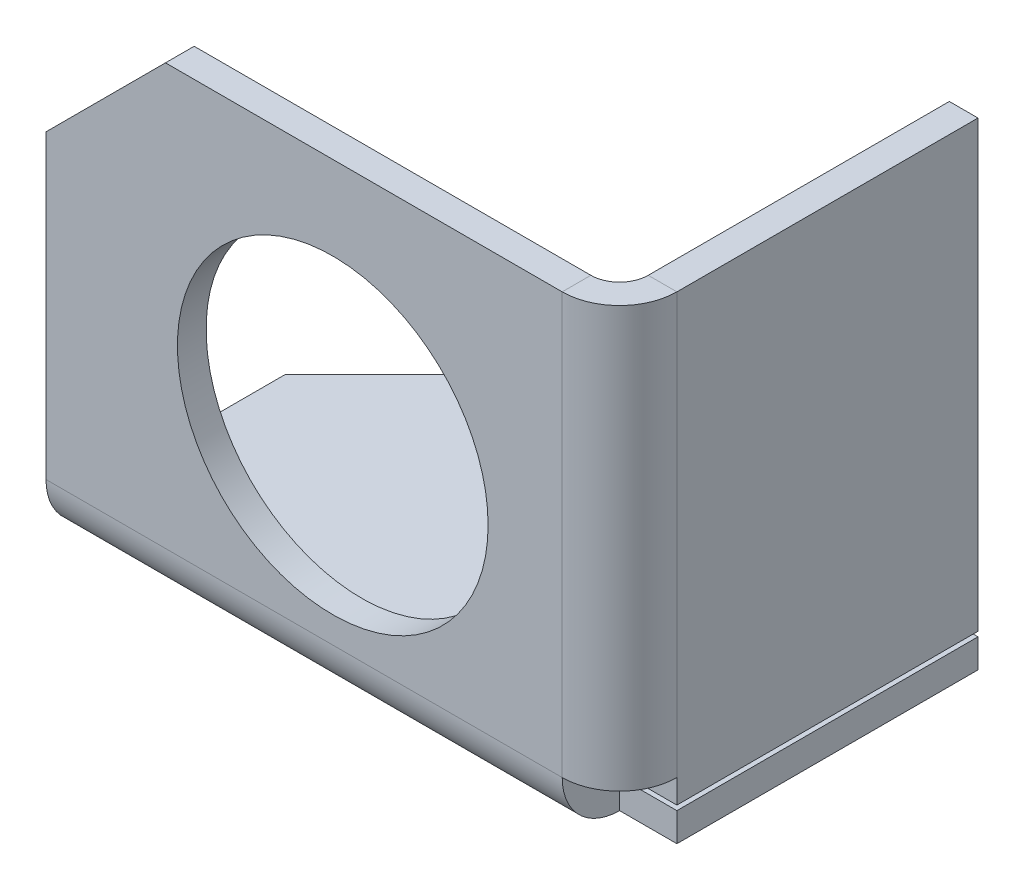
ISO-10303-21;
HEADER;
FILE_DESCRIPTION(('STEP AP214'),'2;1');
FILE_NAME('part.step','',(''),(''),'','','');
FILE_SCHEMA(('AUTOMOTIVE_DESIGN { 1 0 10303 214 1 1 1 1 }'));
ENDSEC;
DATA;
#1=APPLICATION_CONTEXT('core data for automotive mechanical design processes');
#2=APPLICATION_PROTOCOL_DEFINITION('international standard','automotive_design',2000,#1);
#3=PRODUCT_CONTEXT('',#1,'mechanical');
#4=PRODUCT('Part','Part','',(#3));
#5=PRODUCT_RELATED_PRODUCT_CATEGORY('part','',(#4));
#6=PRODUCT_DEFINITION_FORMATION('','',#4);
#7=PRODUCT_DEFINITION_CONTEXT('part definition',#1,'design');
#8=PRODUCT_DEFINITION('design','',#6,#7);
#9=PRODUCT_DEFINITION_SHAPE('','',#8);
#10=(LENGTH_UNIT() NAMED_UNIT(*) SI_UNIT(.MILLI.,.METRE.));
#11=(NAMED_UNIT(*) PLANE_ANGLE_UNIT() SI_UNIT($,.RADIAN.));
#12=(NAMED_UNIT(*) SI_UNIT($,.STERADIAN.) SOLID_ANGLE_UNIT());
#13=UNCERTAINTY_MEASURE_WITH_UNIT(LENGTH_MEASURE(1.E-05),#10,'distance_accuracy_value','');
#14=(GEOMETRIC_REPRESENTATION_CONTEXT(3) GLOBAL_UNCERTAINTY_ASSIGNED_CONTEXT((#13)) GLOBAL_UNIT_ASSIGNED_CONTEXT((#10,
#11,#12)) REPRESENTATION_CONTEXT('',''));
#15=CARTESIAN_POINT('',(0.,0.,0.));
#16=DIRECTION('',(0.,0.,1.));
#17=DIRECTION('',(1.,0.,0.));
#18=AXIS2_PLACEMENT_3D('',#15,#16,#17);
#19=CARTESIAN_POINT('',(0.,88.,6.));
#20=DIRECTION('',(0.,1.,0.));
#21=DIRECTION('',(0.,0.,-1.));
#22=AXIS2_PLACEMENT_3D('',#19,#20,#21);
#23=PLANE('',#22);
#24=DIRECTION('',(-1.,0.,0.));
#25=VECTOR('',#24,1.);
#26=CARTESIAN_POINT('',(0.,88.,6.));
#27=LINE('',#26,#25);
#28=CARTESIAN_POINT('',(108.,88.,6.00000000000001));
#29=VERTEX_POINT('',#28);
#30=CARTESIAN_POINT('',(25.,88.,6.));
#31=VERTEX_POINT('',#30);
#32=EDGE_CURVE('E334',#29,#31,#27,.T.);
#33=ORIENTED_EDGE('',*,*,#32,.F.);
#34=DIRECTION('',(0.,0.,1.));
#35=VECTOR('',#34,1.);
#36=CARTESIAN_POINT('',(108.,88.,0.));
#37=LINE('',#36,#35);
#38=CARTESIAN_POINT('',(108.,88.,0.));
#39=VERTEX_POINT('',#38);
#40=EDGE_CURVE('E348',#39,#29,#37,.T.);
#41=ORIENTED_EDGE('',*,*,#40,.F.);
#42=DIRECTION('',(-1.,0.,0.));
#43=VECTOR('',#42,1.);
#44=CARTESIAN_POINT('',(0.,88.,0.));
#45=LINE('',#44,#43);
#46=CARTESIAN_POINT('',(25.,88.,0.));
#47=VERTEX_POINT('',#46);
#48=EDGE_CURVE('E335',#39,#47,#45,.T.);
#49=ORIENTED_EDGE('',*,*,#48,.T.);
#50=DIRECTION('',(0.,0.,-1.));
#51=VECTOR('',#50,1.);
#52=CARTESIAN_POINT('',(25.,88.,6.));
#53=LINE('',#52,#51);
#54=EDGE_CURVE('E384',#31,#47,#53,.T.);
#55=ORIENTED_EDGE('',*,*,#54,.F.);
#56=EDGE_LOOP('',(#33,#41,#49,#55));
#57=FACE_BOUND('',#56,.T.);
#58=ADVANCED_FACE('F82',(#57),#23,.T.);
#59=CARTESIAN_POINT('',(0.,0.,6.));
#60=DIRECTION('',(0.,0.,1.));
#61=DIRECTION('',(-1.,0.,0.));
#62=AXIS2_PLACEMENT_3D('',#59,#60,#61);
#63=PLANE('',#62);
#64=CARTESIAN_POINT('',(60.,38.,6.));
#65=DIRECTION('',(0.,0.,1.));
#66=DIRECTION('',(1.,0.,0.));
#67=AXIS2_PLACEMENT_3D('',#64,#65,#66);
#68=CIRCLE('',#67,32.5);
#69=CARTESIAN_POINT('',(92.5,38.,6.));
#70=VERTEX_POINT('',#69);
#71=EDGE_CURVE('E322',#70,#70,#68,.T.);
#72=ORIENTED_EDGE('',*,*,#71,.F.);
#73=EDGE_LOOP('',(#72));
#74=FACE_BOUND('',#73,.T.);
#75=DIRECTION('',(0.,-1.,0.));
#76=VECTOR('',#75,1.);
#77=CARTESIAN_POINT('',(0.,0.,6.));
#78=LINE('',#77,#76);
#79=CARTESIAN_POINT('',(0.,62.9999999999999,6.));
#80=VERTEX_POINT('',#79);
#81=CARTESIAN_POINT('',(0.,0.,6.));
#82=VERTEX_POINT('',#81);
#83=EDGE_CURVE('E330',#80,#82,#78,.T.);
#84=ORIENTED_EDGE('',*,*,#83,.T.);
#85=DIRECTION('',(1.,0.,0.));
#86=VECTOR('',#85,1.);
#87=CARTESIAN_POINT('',(0.,0.,6.));
#88=LINE('',#87,#86);
#89=CARTESIAN_POINT('',(108.,0.,6.));
#90=VERTEX_POINT('',#89);
#91=EDGE_CURVE('E356',#82,#90,#88,.T.);
#92=ORIENTED_EDGE('',*,*,#91,.T.);
#93=DIRECTION('',(0.,-1.,0.));
#94=VECTOR('',#93,1.);
#95=CARTESIAN_POINT('',(108.,88.,6.00000000000001));
#96=LINE('',#95,#94);
#97=EDGE_CURVE('E339',#29,#90,#96,.T.);
#98=ORIENTED_EDGE('',*,*,#97,.F.);
#99=ORIENTED_EDGE('',*,*,#32,.T.);
#100=DIRECTION('',(-0.707106781186546,-0.707106781186549,0.));
#101=VECTOR('',#100,1.);
#102=CARTESIAN_POINT('',(-31.5,31.4999999999999,6.));
#103=LINE('',#102,#101);
#104=EDGE_CURVE('E13',#80,#31,#103,.F.);
#105=ORIENTED_EDGE('',*,*,#104,.F.);
#106=EDGE_LOOP('',(#84,#92,#98,#99,#105));
#107=FACE_BOUND('',#106,.T.);
#108=ADVANCED_FACE('F496',(#74,#107),#63,.T.);
#109=CARTESIAN_POINT('',(0.,0.,0.));
#110=DIRECTION('',(0.,0.,1.));
#111=DIRECTION('',(-1.,0.,0.));
#112=AXIS2_PLACEMENT_3D('',#109,#110,#111);
#113=PLANE('',#112);
#114=CARTESIAN_POINT('',(60.,38.,0.));
#115=DIRECTION('',(0.,0.,1.));
#116=DIRECTION('',(1.,0.,0.));
#117=AXIS2_PLACEMENT_3D('',#114,#115,#116);
#118=CIRCLE('',#117,32.5);
#119=CARTESIAN_POINT('',(92.5,38.,0.));
#120=VERTEX_POINT('',#119);
#121=EDGE_CURVE('E315',#120,#120,#118,.T.);
#122=ORIENTED_EDGE('',*,*,#121,.T.);
#123=EDGE_LOOP('',(#122));
#124=FACE_BOUND('',#123,.T.);
#125=ORIENTED_EDGE('',*,*,#48,.F.);
#126=DIRECTION('',(0.,-1.,0.));
#127=VECTOR('',#126,1.);
#128=CARTESIAN_POINT('',(108.,88.,0.));
#129=LINE('',#128,#127);
#130=CARTESIAN_POINT('',(108.,0.,0.));
#131=VERTEX_POINT('',#130);
#132=EDGE_CURVE('E352',#39,#131,#129,.T.);
#133=ORIENTED_EDGE('',*,*,#132,.T.);
#134=DIRECTION('',(1.,0.,0.));
#135=VECTOR('',#134,1.);
#136=CARTESIAN_POINT('',(0.,0.,0.));
#137=LINE('',#136,#135);
#138=CARTESIAN_POINT('',(0.,0.,0.));
#139=VERTEX_POINT('',#138);
#140=EDGE_CURVE('E364',#139,#131,#137,.T.);
#141=ORIENTED_EDGE('',*,*,#140,.F.);
#142=DIRECTION('',(0.,-1.,0.));
#143=VECTOR('',#142,1.);
#144=CARTESIAN_POINT('',(0.,0.,0.));
#145=LINE('',#144,#143);
#146=CARTESIAN_POINT('',(0.,62.9999999999999,0.));
#147=VERTEX_POINT('',#146);
#148=EDGE_CURVE('E326',#147,#139,#145,.T.);
#149=ORIENTED_EDGE('',*,*,#148,.F.);
#150=DIRECTION('',(0.707106781186546,0.707106781186549,0.));
#151=VECTOR('',#150,1.);
#152=CARTESIAN_POINT('',(25.,88.,0.));
#153=LINE('',#152,#151);
#154=EDGE_CURVE('E388',#47,#147,#153,.F.);
#155=ORIENTED_EDGE('',*,*,#154,.F.);
#156=EDGE_LOOP('',(#125,#133,#141,#149,#155));
#157=FACE_BOUND('',#156,.T.);
#158=ADVANCED_FACE('F501',(#124,#157),#113,.F.);
#159=CARTESIAN_POINT('',(0.,0.,6.));
#160=DIRECTION('',(-1.,0.,0.));
#161=DIRECTION('',(0.,0.,-1.));
#162=AXIS2_PLACEMENT_3D('',#159,#160,#161);
#163=PLANE('',#162);
#164=ORIENTED_EDGE('',*,*,#148,.T.);
#165=DIRECTION('',(0.,0.,-1.));
#166=VECTOR('',#165,1.);
#167=CARTESIAN_POINT('',(0.,0.,6.));
#168=LINE('',#167,#166);
#169=EDGE_CURVE('E368',#82,#139,#168,.T.);
#170=ORIENTED_EDGE('',*,*,#169,.F.);
#171=ORIENTED_EDGE('',*,*,#83,.F.);
#172=DIRECTION('',(0.,0.,1.));
#173=VECTOR('',#172,1.);
#174=CARTESIAN_POINT('',(0.,62.9999999999999,6.));
#175=LINE('',#174,#173);
#176=EDGE_CURVE('E91',#147,#80,#175,.T.);
#177=ORIENTED_EDGE('',*,*,#176,.F.);
#178=EDGE_LOOP('',(#164,#170,#171,#177));
#179=FACE_BOUND('',#178,.T.);
#180=ADVANCED_FACE('F497',(#179),#163,.T.);
#181=CARTESIAN_POINT('',(60.,38.,6.));
#182=DIRECTION('',(0.,0.,-1.));
#183=DIRECTION('',(1.,0.,0.));
#184=AXIS2_PLACEMENT_3D('',#181,#182,#183);
#185=CYLINDRICAL_SURFACE('',#184,32.5);
#186=ORIENTED_EDGE('',*,*,#71,.T.);
#187=EDGE_LOOP('',(#186));
#188=FACE_BOUND('',#187,.T.);
#189=ORIENTED_EDGE('',*,*,#121,.F.);
#190=EDGE_LOOP('',(#189));
#191=FACE_BOUND('',#190,.T.);
#192=ADVANCED_FACE('F535',(#188,#191),#185,.F.);
#193=CARTESIAN_POINT('',(108.,0.,-5.99999999999999));
#194=DIRECTION('',(0.,-1.,0.));
#195=DIRECTION('',(0.,0.,1.));
#196=AXIS2_PLACEMENT_3D('',#193,#194,#195);
#197=PLANE('',#196);
#198=DIRECTION('',(1.,0.,0.));
#199=VECTOR('',#198,1.);
#200=CARTESIAN_POINT('',(120.,0.,-6.0000000000001));
#201=LINE('',#200,#199);
#202=CARTESIAN_POINT('',(114.,0.,-6.00000000000005));
#203=VERTEX_POINT('',#202);
#204=CARTESIAN_POINT('',(120.,0.,-5.99999999999995));
#205=VERTEX_POINT('',#204);
#206=EDGE_CURVE('E252',#203,#205,#201,.T.);
#207=ORIENTED_EDGE('',*,*,#206,.T.);
#208=CARTESIAN_POINT('',(108.,0.,-5.99999999999999));
#209=DIRECTION('',(0.,-1.,0.));
#210=DIRECTION('',(0.,0.,-1.));
#211=AXIS2_PLACEMENT_3D('',#208,#209,#210);
#212=CIRCLE('',#211,12.);
#213=EDGE_CURVE('E306',#205,#90,#212,.T.);
#214=ORIENTED_EDGE('',*,*,#213,.T.);
#215=DIRECTION('',(0.,0.,1.));
#216=VECTOR('',#215,1.);
#217=CARTESIAN_POINT('',(108.,0.,0.));
#218=LINE('',#217,#216);
#219=EDGE_CURVE('E360',#131,#90,#218,.T.);
#220=ORIENTED_EDGE('',*,*,#219,.F.);
#221=CARTESIAN_POINT('',(108.,0.,-5.99999999999999));
#222=DIRECTION('',(0.,1.,0.));
#223=DIRECTION('',(0.,0.,1.));
#224=AXIS2_PLACEMENT_3D('',#221,#222,#223);
#225=CIRCLE('',#224,6.);
#226=EDGE_CURVE('E256',#203,#131,#225,.F.);
#227=ORIENTED_EDGE('',*,*,#226,.F.);
#228=EDGE_LOOP('',(#207,#214,#220,#227));
#229=FACE_BOUND('',#228,.T.);
#230=ADVANCED_FACE('F510',(#229),#197,.T.);
#231=CARTESIAN_POINT('',(108.,88.,-5.99999999999999));
#232=DIRECTION('',(0.,1.,0.));
#233=DIRECTION('',(0.,0.,-1.));
#234=AXIS2_PLACEMENT_3D('',#231,#232,#233);
#235=PLANE('',#234);
#236=CARTESIAN_POINT('',(108.,88.,-5.99999999999999));
#237=DIRECTION('',(0.,1.,0.));
#238=DIRECTION('',(0.,0.,1.));
#239=AXIS2_PLACEMENT_3D('',#236,#237,#238);
#240=CIRCLE('',#239,6.);
#241=CARTESIAN_POINT('',(114.,88.,-6.00000000000012));
#242=VERTEX_POINT('',#241);
#243=EDGE_CURVE('E311',#39,#242,#240,.T.);
#244=ORIENTED_EDGE('',*,*,#243,.F.);
#245=ORIENTED_EDGE('',*,*,#40,.T.);
#246=CARTESIAN_POINT('',(108.,88.,-5.99999999999999));
#247=DIRECTION('',(0.,1.,0.));
#248=DIRECTION('',(0.,0.,1.));
#249=AXIS2_PLACEMENT_3D('',#246,#247,#248);
#250=CIRCLE('',#249,12.);
#251=CARTESIAN_POINT('',(120.,88.,-6.0000000000001));
#252=VERTEX_POINT('',#251);
#253=EDGE_CURVE('E310',#29,#252,#250,.T.);
#254=ORIENTED_EDGE('',*,*,#253,.T.);
#255=DIRECTION('',(1.,0.,0.));
#256=VECTOR('',#255,1.);
#257=CARTESIAN_POINT('',(114.,88.,-6.00000000000012));
#258=LINE('',#257,#256);
#259=EDGE_CURVE('E295',#242,#252,#258,.T.);
#260=ORIENTED_EDGE('',*,*,#259,.F.);
#261=EDGE_LOOP('',(#244,#245,#254,#260));
#262=FACE_BOUND('',#261,.T.);
#263=ADVANCED_FACE('F517',(#262),#235,.T.);
#264=CARTESIAN_POINT('',(108.,133.330059269666,-5.99999999999999));
#265=DIRECTION('',(0.,-1.,0.));
#266=DIRECTION('',(0.,0.,1.));
#267=AXIS2_PLACEMENT_3D('',#264,#265,#266);
#268=CYLINDRICAL_SURFACE('',#267,12.);
#269=ORIENTED_EDGE('',*,*,#97,.T.);
#270=ORIENTED_EDGE('',*,*,#213,.F.);
#271=DIRECTION('',(0.,-1.,0.));
#272=VECTOR('',#271,1.);
#273=CARTESIAN_POINT('',(120.,0.,-6.0000000000001));
#274=LINE('',#273,#272);
#275=EDGE_CURVE('E244',#252,#205,#274,.T.);
#276=ORIENTED_EDGE('',*,*,#275,.F.);
#277=ORIENTED_EDGE('',*,*,#253,.F.);
#278=EDGE_LOOP('',(#269,#270,#276,#277));
#279=FACE_BOUND('',#278,.T.);
#280=ADVANCED_FACE('F514',(#279),#268,.T.);
#281=CARTESIAN_POINT('',(108.,133.330059269666,-5.99999999999999));
#282=DIRECTION('',(0.,-1.,0.));
#283=DIRECTION('',(0.,0.,1.));
#284=AXIS2_PLACEMENT_3D('',#281,#282,#283);
#285=CYLINDRICAL_SURFACE('',#284,6.);
#286=ORIENTED_EDGE('',*,*,#132,.F.);
#287=ORIENTED_EDGE('',*,*,#243,.T.);
#288=DIRECTION('',(0.,1.,0.));
#289=VECTOR('',#288,1.);
#290=CARTESIAN_POINT('',(114.,0.,-6.00000000000012));
#291=LINE('',#290,#289);
#292=EDGE_CURVE('E299',#203,#242,#291,.T.);
#293=ORIENTED_EDGE('',*,*,#292,.F.);
#294=ORIENTED_EDGE('',*,*,#226,.T.);
#295=EDGE_LOOP('',(#286,#287,#293,#294));
#296=FACE_BOUND('',#295,.T.);
#297=ADVANCED_FACE('F505',(#296),#285,.F.);
#298=CARTESIAN_POINT('',(114.,-5.,-6.00000000000005));
#299=DIRECTION('',(0.,1.,0.));
#300=DIRECTION('',(0.,0.,1.));
#301=AXIS2_PLACEMENT_3D('',#298,#299,#300);
#302=PLANE('',#301);
#303=DIRECTION('',(0.,0.,-1.));
#304=VECTOR('',#303,1.);
#305=CARTESIAN_POINT('',(120.,-5.,-6.00000000000003));
#306=LINE('',#305,#304);
#307=CARTESIAN_POINT('',(120.,-5.,-6.00000000000003));
#308=VERTEX_POINT('',#307);
#309=CARTESIAN_POINT('',(120.,-5.00000000000021,-69.0000000000001));
#310=VERTEX_POINT('',#309);
#311=EDGE_CURVE('E291',#308,#310,#306,.T.);
#312=ORIENTED_EDGE('',*,*,#311,.F.);
#313=DIRECTION('',(1.,0.,0.));
#314=VECTOR('',#313,1.);
#315=CARTESIAN_POINT('',(114.,-5.,-6.00000000000005));
#316=LINE('',#315,#314);
#317=CARTESIAN_POINT('',(114.,-5.,-6.00000000000005));
#318=VERTEX_POINT('',#317);
#319=EDGE_CURVE('E287',#318,#308,#316,.T.);
#320=ORIENTED_EDGE('',*,*,#319,.F.);
#321=DIRECTION('',(0.,0.,-1.));
#322=VECTOR('',#321,1.);
#323=CARTESIAN_POINT('',(114.,-5.,-6.00000000000005));
#324=LINE('',#323,#322);
#325=CARTESIAN_POINT('',(114.,-5.00000000000021,-69.0000000000001));
#326=VERTEX_POINT('',#325);
#327=EDGE_CURVE('E260',#318,#326,#324,.T.);
#328=ORIENTED_EDGE('',*,*,#327,.T.);
#329=DIRECTION('',(1.,0.,0.));
#330=VECTOR('',#329,1.);
#331=CARTESIAN_POINT('',(114.,-5.00000000000021,-69.0000000000001));
#332=LINE('',#331,#330);
#333=EDGE_CURVE('E280',#326,#310,#332,.T.);
#334=ORIENTED_EDGE('',*,*,#333,.T.);
#335=EDGE_LOOP('',(#312,#320,#328,#334));
#336=FACE_BOUND('',#335,.T.);
#337=ADVANCED_FACE('F667',(#336),#302,.F.);
#338=CARTESIAN_POINT('',(120.,0.,-69.0000000000001));
#339=DIRECTION('',(0.,0.,1.));
#340=DIRECTION('',(-1.,0.,0.));
#341=AXIS2_PLACEMENT_3D('',#338,#339,#340);
#342=PLANE('',#341);
#343=DIRECTION('',(0.,1.,0.));
#344=VECTOR('',#343,1.);
#345=CARTESIAN_POINT('',(114.,0.,-69.0000000000001));
#346=LINE('',#345,#344);
#347=CARTESIAN_POINT('',(114.,88.,-69.0000000000001));
#348=VERTEX_POINT('',#347);
#349=EDGE_CURVE('E284',#348,#326,#346,.F.);
#350=ORIENTED_EDGE('',*,*,#349,.F.);
#351=DIRECTION('',(-1.,0.,0.));
#352=VECTOR('',#351,1.);
#353=CARTESIAN_POINT('',(120.,88.,-69.0000000000001));
#354=LINE('',#353,#352);
#355=CARTESIAN_POINT('',(120.,88.,-69.0000000000001));
#356=VERTEX_POINT('',#355);
#357=EDGE_CURVE('E276',#356,#348,#354,.T.);
#358=ORIENTED_EDGE('',*,*,#357,.F.);
#359=DIRECTION('',(0.,-1.,0.));
#360=VECTOR('',#359,1.);
#361=CARTESIAN_POINT('',(120.,0.,-69.0000000000001));
#362=LINE('',#361,#360);
#363=EDGE_CURVE('E270',#356,#310,#362,.T.);
#364=ORIENTED_EDGE('',*,*,#363,.T.);
#365=ORIENTED_EDGE('',*,*,#333,.F.);
#366=EDGE_LOOP('',(#350,#358,#364,#365));
#367=FACE_BOUND('',#366,.T.);
#368=ADVANCED_FACE('F672',(#367),#342,.F.);
#369=CARTESIAN_POINT('',(120.,0.,2.77555756156289E-13));
#370=DIRECTION('',(-1.,0.,0.));
#371=DIRECTION('',(0.,0.,-1.));
#372=AXIS2_PLACEMENT_3D('',#369,#370,#371);
#373=PLANE('',#372);
#374=ORIENTED_EDGE('',*,*,#275,.T.);
#375=DIRECTION('',(0.,-1.,0.));
#376=VECTOR('',#375,1.);
#377=CARTESIAN_POINT('',(120.,0.,-6.00000000000003));
#378=LINE('',#377,#376);
#379=EDGE_CURVE('E257',#205,#308,#378,.T.);
#380=ORIENTED_EDGE('',*,*,#379,.T.);
#381=ORIENTED_EDGE('',*,*,#311,.T.);
#382=ORIENTED_EDGE('',*,*,#363,.F.);
#383=DIRECTION('',(0.,0.,-1.));
#384=VECTOR('',#383,1.);
#385=CARTESIAN_POINT('',(120.,88.,2.63677968348475E-13));
#386=LINE('',#385,#384);
#387=EDGE_CURVE('E273',#252,#356,#386,.T.);
#388=ORIENTED_EDGE('',*,*,#387,.F.);
#389=EDGE_LOOP('',(#374,#380,#381,#382,#388));
#390=FACE_BOUND('',#389,.T.);
#391=ADVANCED_FACE('F682',(#390),#373,.F.);
#392=CARTESIAN_POINT('',(120.,88.,-69.0000000000001));
#393=DIRECTION('',(0.,-1.,0.));
#394=DIRECTION('',(0.,0.,1.));
#395=AXIS2_PLACEMENT_3D('',#392,#393,#394);
#396=PLANE('',#395);
#397=ORIENTED_EDGE('',*,*,#259,.T.);
#398=ORIENTED_EDGE('',*,*,#387,.T.);
#399=ORIENTED_EDGE('',*,*,#357,.T.);
#400=DIRECTION('',(0.,0.,1.));
#401=VECTOR('',#400,1.);
#402=CARTESIAN_POINT('',(114.,88.,-69.0000000000001));
#403=LINE('',#402,#401);
#404=EDGE_CURVE('E267',#242,#348,#403,.F.);
#405=ORIENTED_EDGE('',*,*,#404,.F.);
#406=EDGE_LOOP('',(#397,#398,#399,#405));
#407=FACE_BOUND('',#406,.T.);
#408=ADVANCED_FACE('F692',(#407),#396,.F.);
#409=CARTESIAN_POINT('',(114.,0.,2.63677968348475E-13));
#410=DIRECTION('',(-1.,0.,0.));
#411=DIRECTION('',(0.,0.,-1.));
#412=AXIS2_PLACEMENT_3D('',#409,#410,#411);
#413=PLANE('',#412);
#414=ORIENTED_EDGE('',*,*,#404,.T.);
#415=ORIENTED_EDGE('',*,*,#349,.T.);
#416=ORIENTED_EDGE('',*,*,#327,.F.);
#417=DIRECTION('',(0.,-1.,0.));
#418=VECTOR('',#417,1.);
#419=CARTESIAN_POINT('',(114.,0.,-6.00000000000005));
#420=LINE('',#419,#418);
#421=EDGE_CURVE('E264',#203,#318,#420,.T.);
#422=ORIENTED_EDGE('',*,*,#421,.F.);
#423=ORIENTED_EDGE('',*,*,#292,.T.);
#424=EDGE_LOOP('',(#414,#415,#416,#422,#423));
#425=FACE_BOUND('',#424,.T.);
#426=ADVANCED_FACE('F702',(#425),#413,.T.);
#427=CARTESIAN_POINT('',(114.,0.,-6.00000000000005));
#428=DIRECTION('',(0.,0.,-1.));
#429=DIRECTION('',(1.,0.,0.));
#430=AXIS2_PLACEMENT_3D('',#427,#428,#429);
#431=PLANE('',#430);
#432=ORIENTED_EDGE('',*,*,#379,.F.);
#433=ORIENTED_EDGE('',*,*,#206,.F.);
#434=ORIENTED_EDGE('',*,*,#421,.T.);
#435=ORIENTED_EDGE('',*,*,#319,.T.);
#436=EDGE_LOOP('',(#432,#433,#434,#435));
#437=FACE_BOUND('',#436,.T.);
#438=ADVANCED_FACE('F651',(#437),#431,.F.);
#439=CARTESIAN_POINT('',(0.,0.,-6.));
#440=DIRECTION('',(-1.,0.,0.));
#441=DIRECTION('',(0.,0.,-1.));
#442=AXIS2_PLACEMENT_3D('',#439,#440,#441);
#443=PLANE('',#442);
#444=DIRECTION('',(0.,-1.,0.));
#445=VECTOR('',#444,1.);
#446=CARTESIAN_POINT('',(0.,-11.9999999999999,-6.00000000000009));
#447=LINE('',#446,#445);
#448=CARTESIAN_POINT('',(0.,-5.99999999999995,-6.00000000000012));
#449=VERTEX_POINT('',#448);
#450=CARTESIAN_POINT('',(0.,-12.,-5.99999999999997));
#451=VERTEX_POINT('',#450);
#452=EDGE_CURVE('E438',#449,#451,#447,.T.);
#453=ORIENTED_EDGE('',*,*,#452,.T.);
#454=CARTESIAN_POINT('',(0.,0.,-6.));
#455=DIRECTION('',(-1.,0.,0.));
#456=DIRECTION('',(0.,0.,1.));
#457=AXIS2_PLACEMENT_3D('',#454,#455,#456);
#458=CIRCLE('',#457,12.);
#459=EDGE_CURVE('E236',#451,#82,#458,.T.);
#460=ORIENTED_EDGE('',*,*,#459,.T.);
#461=ORIENTED_EDGE('',*,*,#169,.T.);
#462=CARTESIAN_POINT('',(0.,0.,-6.));
#463=DIRECTION('',(1.,0.,0.));
#464=DIRECTION('',(0.,0.,-1.));
#465=AXIS2_PLACEMENT_3D('',#462,#463,#464);
#466=CIRCLE('',#465,6.);
#467=EDGE_CURVE('E245',#449,#139,#466,.F.);
#468=ORIENTED_EDGE('',*,*,#467,.F.);
#469=EDGE_LOOP('',(#453,#460,#461,#468));
#470=FACE_BOUND('',#469,.T.);
#471=ADVANCED_FACE('F482',(#470),#443,.T.);
#472=CARTESIAN_POINT('',(108.,0.,-6.));
#473=DIRECTION('',(1.,0.,0.));
#474=DIRECTION('',(0.,0.,1.));
#475=AXIS2_PLACEMENT_3D('',#472,#473,#474);
#476=PLANE('',#475);
#477=CARTESIAN_POINT('',(108.,0.,-6.));
#478=DIRECTION('',(1.,0.,0.));
#479=DIRECTION('',(0.,0.,-1.));
#480=AXIS2_PLACEMENT_3D('',#477,#478,#479);
#481=CIRCLE('',#480,6.);
#482=CARTESIAN_POINT('',(108.,-5.99999999999994,-6.00000000000011));
#483=VERTEX_POINT('',#482);
#484=EDGE_CURVE('E240',#131,#483,#481,.T.);
#485=ORIENTED_EDGE('',*,*,#484,.F.);
#486=ORIENTED_EDGE('',*,*,#219,.T.);
#487=CARTESIAN_POINT('',(108.,0.,-6.));
#488=DIRECTION('',(1.,0.,0.));
#489=DIRECTION('',(0.,0.,-1.));
#490=AXIS2_PLACEMENT_3D('',#487,#488,#489);
#491=CIRCLE('',#490,12.);
#492=CARTESIAN_POINT('',(108.,-11.9999999999999,-6.00000000000009));
#493=VERTEX_POINT('',#492);
#494=EDGE_CURVE('E239',#90,#493,#491,.T.);
#495=ORIENTED_EDGE('',*,*,#494,.T.);
#496=DIRECTION('',(0.,-1.,0.));
#497=VECTOR('',#496,1.);
#498=CARTESIAN_POINT('',(108.,-5.99999999999995,-6.00000000000011));
#499=LINE('',#498,#497);
#500=EDGE_CURVE('E222',#483,#493,#499,.T.);
#501=ORIENTED_EDGE('',*,*,#500,.F.);
#502=EDGE_LOOP('',(#485,#486,#495,#501));
#503=FACE_BOUND('',#502,.T.);
#504=ADVANCED_FACE('F489',(#503),#476,.T.);
#505=CARTESIAN_POINT('',(163.086477113903,0.,-6.));
#506=DIRECTION('',(-1.,0.,0.));
#507=DIRECTION('',(0.,0.,-1.));
#508=AXIS2_PLACEMENT_3D('',#505,#506,#507);
#509=CYLINDRICAL_SURFACE('',#508,12.);
#510=ORIENTED_EDGE('',*,*,#91,.F.);
#511=ORIENTED_EDGE('',*,*,#459,.F.);
#512=DIRECTION('',(-1.,0.,0.));
#513=VECTOR('',#512,1.);
#514=CARTESIAN_POINT('',(0.,-11.9999999999999,-6.00000000000009));
#515=LINE('',#514,#513);
#516=EDGE_CURVE('E232',#493,#451,#515,.T.);
#517=ORIENTED_EDGE('',*,*,#516,.F.);
#518=ORIENTED_EDGE('',*,*,#494,.F.);
#519=EDGE_LOOP('',(#510,#511,#517,#518));
#520=FACE_BOUND('',#519,.T.);
#521=ADVANCED_FACE('F493',(#520),#509,.T.);
#522=CARTESIAN_POINT('',(163.086477113903,0.,-6.));
#523=DIRECTION('',(-1.,0.,0.));
#524=DIRECTION('',(0.,0.,-1.));
#525=AXIS2_PLACEMENT_3D('',#522,#523,#524);
#526=CYLINDRICAL_SURFACE('',#525,6.);
#527=ORIENTED_EDGE('',*,*,#140,.T.);
#528=ORIENTED_EDGE('',*,*,#484,.T.);
#529=DIRECTION('',(1.,0.,0.));
#530=VECTOR('',#529,1.);
#531=CARTESIAN_POINT('',(0.,-5.99999999999995,-6.00000000000011));
#532=LINE('',#531,#530);
#533=EDGE_CURVE('E227',#449,#483,#532,.T.);
#534=ORIENTED_EDGE('',*,*,#533,.F.);
#535=ORIENTED_EDGE('',*,*,#467,.T.);
#536=EDGE_LOOP('',(#527,#528,#534,#535));
#537=FACE_BOUND('',#536,.T.);
#538=ADVANCED_FACE('F486',(#537),#526,.F.);
#539=CARTESIAN_POINT('',(0.,-12.0000000000002,-69.0000000000001));
#540=DIRECTION('',(0.,0.,1.));
#541=DIRECTION('',(0.,1.,0.));
#542=AXIS2_PLACEMENT_3D('',#539,#540,#541);
#543=PLANE('',#542);
#544=DIRECTION('',(1.,0.,0.));
#545=VECTOR('',#544,1.);
#546=CARTESIAN_POINT('',(0.,-6.00000000000017,-69.0000000000001));
#547=LINE('',#546,#545);
#548=CARTESIAN_POINT('',(120.,-6.00000000000017,-69.0000000000001));
#549=VERTEX_POINT('',#548);
#550=CARTESIAN_POINT('',(25.0000000000001,-6.00000000000017,-69.0000000000001));
#551=VERTEX_POINT('',#550);
#552=EDGE_CURVE('E198',#549,#551,#547,.F.);
#553=ORIENTED_EDGE('',*,*,#552,.F.);
#554=DIRECTION('',(0.,1.,0.));
#555=VECTOR('',#554,1.);
#556=CARTESIAN_POINT('',(120.,-12.0000000000002,-69.0000000000001));
#557=LINE('',#556,#555);
#558=CARTESIAN_POINT('',(120.,-12.0000000000002,-69.0000000000001));
#559=VERTEX_POINT('',#558);
#560=EDGE_CURVE('E206',#559,#549,#557,.T.);
#561=ORIENTED_EDGE('',*,*,#560,.F.);
#562=DIRECTION('',(-1.,0.,0.));
#563=VECTOR('',#562,1.);
#564=CARTESIAN_POINT('',(0.,-12.0000000000002,-69.0000000000001));
#565=LINE('',#564,#563);
#566=CARTESIAN_POINT('',(25.0000000000001,-12.0000000000002,-69.0000000000001));
#567=VERTEX_POINT('',#566);
#568=EDGE_CURVE('E450',#559,#567,#565,.T.);
#569=ORIENTED_EDGE('',*,*,#568,.T.);
#570=DIRECTION('',(0.,-1.,0.));
#571=VECTOR('',#570,1.);
#572=CARTESIAN_POINT('',(25.0000000000001,-12.0000000000002,-69.0000000000001));
#573=LINE('',#572,#571);
#574=EDGE_CURVE('E220',#551,#567,#573,.T.);
#575=ORIENTED_EDGE('',*,*,#574,.F.);
#576=EDGE_LOOP('',(#553,#561,#569,#575));
#577=FACE_BOUND('',#576,.T.);
#578=ADVANCED_FACE('F218',(#577),#543,.F.);
#579=CARTESIAN_POINT('',(120.,-11.9999999999999,-6.00000000000009));
#580=DIRECTION('',(-1.,0.,0.));
#581=DIRECTION('',(0.,0.,-1.));
#582=AXIS2_PLACEMENT_3D('',#579,#580,#581);
#583=PLANE('',#582);
#584=DIRECTION('',(0.,0.,-1.));
#585=VECTOR('',#584,1.);
#586=CARTESIAN_POINT('',(120.,-5.99999999999994,-6.00000000000011));
#587=LINE('',#586,#585);
#588=CARTESIAN_POINT('',(120.,-5.99999999999994,-6.00000000000011));
#589=VERTEX_POINT('',#588);
#590=EDGE_CURVE('E193',#589,#549,#587,.T.);
#591=ORIENTED_EDGE('',*,*,#590,.F.);
#592=DIRECTION('',(0.,1.,0.));
#593=VECTOR('',#592,1.);
#594=CARTESIAN_POINT('',(120.,-11.9999999999999,-6.00000000000009));
#595=LINE('',#594,#593);
#596=CARTESIAN_POINT('',(120.,-11.9999999999999,-6.00000000000009));
#597=VERTEX_POINT('',#596);
#598=EDGE_CURVE('E205',#597,#589,#595,.T.);
#599=ORIENTED_EDGE('',*,*,#598,.F.);
#600=DIRECTION('',(0.,0.,-1.));
#601=VECTOR('',#600,1.);
#602=CARTESIAN_POINT('',(120.,-11.9999999999999,-6.00000000000009));
#603=LINE('',#602,#601);
#604=EDGE_CURVE('E211',#597,#559,#603,.T.);
#605=ORIENTED_EDGE('',*,*,#604,.T.);
#606=ORIENTED_EDGE('',*,*,#560,.T.);
#607=EDGE_LOOP('',(#591,#599,#605,#606));
#608=FACE_BOUND('',#607,.T.);
#609=ADVANCED_FACE('F209',(#608),#583,.F.);
#610=CARTESIAN_POINT('',(0.,-11.9999999999999,-1.16226472890446E-13));
#611=DIRECTION('',(0.,1.,0.));
#612=DIRECTION('',(0.,0.,-1.));
#613=AXIS2_PLACEMENT_3D('',#610,#611,#612);
#614=PLANE('',#613);
#615=ORIENTED_EDGE('',*,*,#568,.F.);
#616=ORIENTED_EDGE('',*,*,#604,.F.);
#617=DIRECTION('',(1.,0.,0.));
#618=VECTOR('',#617,1.);
#619=CARTESIAN_POINT('',(108.,-11.9999999999999,-6.00000000000009));
#620=LINE('',#619,#618);
#621=EDGE_CURVE('E457',#493,#597,#620,.T.);
#622=ORIENTED_EDGE('',*,*,#621,.F.);
#623=ORIENTED_EDGE('',*,*,#516,.T.);
#624=DIRECTION('',(0.,0.,1.));
#625=VECTOR('',#624,1.);
#626=CARTESIAN_POINT('',(0.,-11.9999999999999,-1.16226472890446E-13));
#627=LINE('',#626,#625);
#628=CARTESIAN_POINT('',(0.,-12.0000000000001,-44.0000000000001));
#629=VERTEX_POINT('',#628);
#630=EDGE_CURVE('E446',#629,#451,#627,.T.);
#631=ORIENTED_EDGE('',*,*,#630,.F.);
#632=DIRECTION('',(0.707106781186549,0.,-0.707106781186546));
#633=VECTOR('',#632,1.);
#634=CARTESIAN_POINT('',(0.,-12.0000000000001,-44.0000000000001));
#635=LINE('',#634,#633);
#636=EDGE_CURVE('E380',#567,#629,#635,.F.);
#637=ORIENTED_EDGE('',*,*,#636,.F.);
#638=EDGE_LOOP('',(#615,#616,#622,#623,#631,#637));
#639=FACE_BOUND('',#638,.T.);
#640=ADVANCED_FACE('F471',(#639),#614,.F.);
#641=CARTESIAN_POINT('',(108.,-11.9999999999999,-6.00000000000009));
#642=DIRECTION('',(0.,0.,-1.));
#643=DIRECTION('',(0.,-1.,0.));
#644=AXIS2_PLACEMENT_3D('',#641,#642,#643);
#645=PLANE('',#644);
#646=DIRECTION('',(1.,0.,0.));
#647=VECTOR('',#646,1.);
#648=CARTESIAN_POINT('',(108.,-5.99999999999994,-6.00000000000011));
#649=LINE('',#648,#647);
#650=EDGE_CURVE('E200',#483,#589,#649,.T.);
#651=ORIENTED_EDGE('',*,*,#650,.F.);
#652=ORIENTED_EDGE('',*,*,#500,.T.);
#653=ORIENTED_EDGE('',*,*,#621,.T.);
#654=ORIENTED_EDGE('',*,*,#598,.T.);
#655=EDGE_LOOP('',(#651,#652,#653,#654));
#656=FACE_BOUND('',#655,.T.);
#657=ADVANCED_FACE('F467',(#656),#645,.F.);
#658=CARTESIAN_POINT('',(0.,-5.99999999999992,-1.37043154602168E-13));
#659=DIRECTION('',(0.,1.,0.));
#660=DIRECTION('',(0.,0.,-1.));
#661=AXIS2_PLACEMENT_3D('',#658,#659,#660);
#662=PLANE('',#661);
#663=DIRECTION('',(0.,0.,-1.));
#664=VECTOR('',#663,1.);
#665=CARTESIAN_POINT('',(0.,-5.99999999999992,-1.37043154602168E-13));
#666=LINE('',#665,#664);
#667=CARTESIAN_POINT('',(0.,-6.00000000000008,-44.0000000000001));
#668=VERTEX_POINT('',#667);
#669=EDGE_CURVE('E248',#668,#449,#666,.F.);
#670=ORIENTED_EDGE('',*,*,#669,.T.);
#671=ORIENTED_EDGE('',*,*,#533,.T.);
#672=ORIENTED_EDGE('',*,*,#650,.T.);
#673=ORIENTED_EDGE('',*,*,#590,.T.);
#674=ORIENTED_EDGE('',*,*,#552,.T.);
#675=DIRECTION('',(-0.707106781186549,0.,0.707106781186546));
#676=VECTOR('',#675,1.);
#677=CARTESIAN_POINT('',(-22.,-6.,-22.0000000000002));
#678=LINE('',#677,#676);
#679=EDGE_CURVE('E375',#668,#551,#678,.F.);
#680=ORIENTED_EDGE('',*,*,#679,.F.);
#681=EDGE_LOOP('',(#670,#671,#672,#673,#674,#680));
#682=FACE_BOUND('',#681,.T.);
#683=ADVANCED_FACE('F195',(#682),#662,.T.);
#684=CARTESIAN_POINT('',(0.,-11.9999999999999,-1.16226472890446E-13));
#685=DIRECTION('',(1.,0.,0.));
#686=DIRECTION('',(0.,0.,1.));
#687=AXIS2_PLACEMENT_3D('',#684,#685,#686);
#688=PLANE('',#687);
#689=ORIENTED_EDGE('',*,*,#630,.T.);
#690=ORIENTED_EDGE('',*,*,#452,.F.);
#691=ORIENTED_EDGE('',*,*,#669,.F.);
#692=DIRECTION('',(0.,1.,0.));
#693=VECTOR('',#692,1.);
#694=CARTESIAN_POINT('',(0.,-12.0000000000001,-44.0000000000001));
#695=LINE('',#694,#693);
#696=EDGE_CURVE('E372',#629,#668,#695,.T.);
#697=ORIENTED_EDGE('',*,*,#696,.F.);
#698=EDGE_LOOP('',(#689,#690,#691,#697));
#699=FACE_BOUND('',#698,.T.);
#700=ADVANCED_FACE('F479',(#699),#688,.F.);
#701=CARTESIAN_POINT('',(0.,-12.0000000000001,-44.0000000000001));
#702=DIRECTION('',(0.707106781186546,0.,0.707106781186549));
#703=DIRECTION('',(0.,1.,0.));
#704=AXIS2_PLACEMENT_3D('',#701,#702,#703);
#705=PLANE('',#704);
#706=ORIENTED_EDGE('',*,*,#636,.T.);
#707=ORIENTED_EDGE('',*,*,#696,.T.);
#708=ORIENTED_EDGE('',*,*,#679,.T.);
#709=ORIENTED_EDGE('',*,*,#574,.T.);
#710=EDGE_LOOP('',(#706,#707,#708,#709));
#711=FACE_BOUND('',#710,.T.);
#712=ADVANCED_FACE('F474',(#711),#705,.F.);
#713=CARTESIAN_POINT('',(25.,88.,6.));
#714=DIRECTION('',(0.707106781186549,-0.707106781186546,0.));
#715=DIRECTION('',(0.,0.,-1.));
#716=AXIS2_PLACEMENT_3D('',#713,#714,#715);
#717=PLANE('',#716);
#718=ORIENTED_EDGE('',*,*,#104,.T.);
#719=ORIENTED_EDGE('',*,*,#54,.T.);
#720=ORIENTED_EDGE('',*,*,#154,.T.);
#721=ORIENTED_EDGE('',*,*,#176,.T.);
#722=EDGE_LOOP('',(#718,#719,#720,#721));
#723=FACE_BOUND('',#722,.T.);
#724=ADVANCED_FACE('F84',(#723),#717,.F.);
#725=CLOSED_SHELL('',(#58,#108,#158,#180,#192,#230,#263,#280,#297,#337,#368,#391,#408,#426,#438,
#471,#504,#521,#538,#578,#609,#640,#657,#683,#700,#712,#724));
#726=MANIFOLD_SOLID_BREP('B2',#725);
#727=ADVANCED_BREP_SHAPE_REPRESENTATION('',(#18,#726),#14);
#728=SHAPE_DEFINITION_REPRESENTATION(#9,#727);
ENDSEC;
END-ISO-10303-21;
